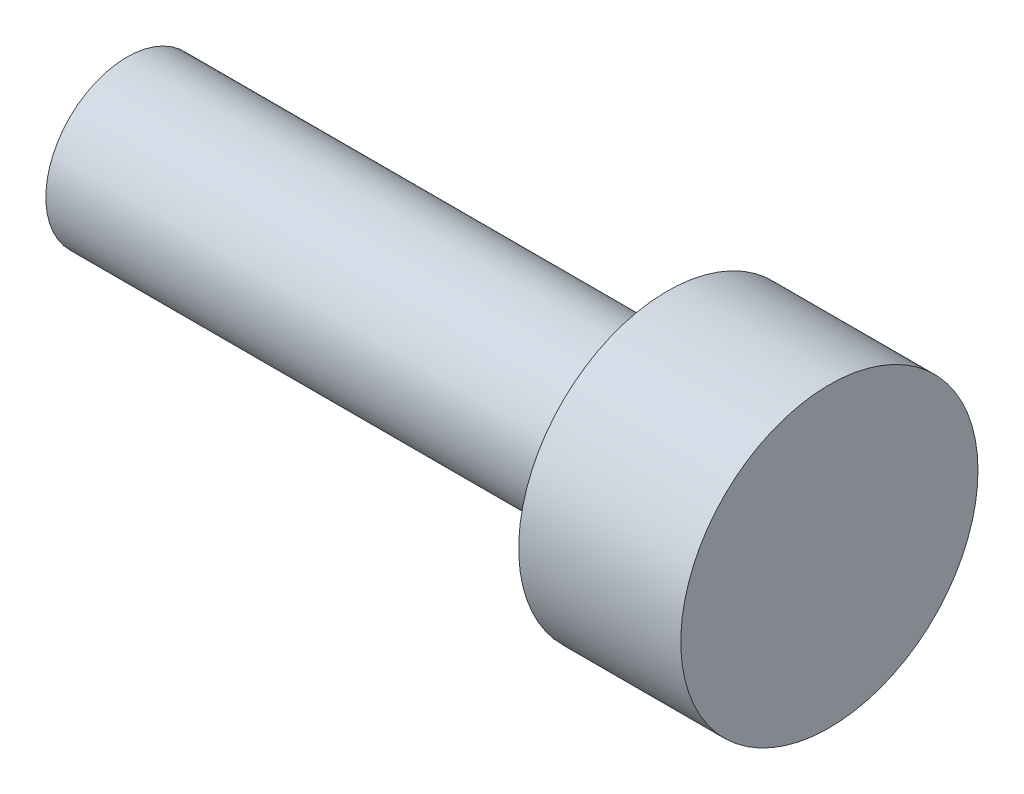
ISO-10303-21;
HEADER;
FILE_DESCRIPTION(('STEP AP214'),'2;1');
FILE_NAME('part.step','',(''),(''),'','','');
FILE_SCHEMA(('AUTOMOTIVE_DESIGN { 1 0 10303 214 1 1 1 1 }'));
ENDSEC;
DATA;
#1=APPLICATION_CONTEXT('core data for automotive mechanical design processes');
#2=APPLICATION_PROTOCOL_DEFINITION('international standard','automotive_design',2000,#1);
#3=PRODUCT_CONTEXT('',#1,'mechanical');
#4=PRODUCT('Part','Part','',(#3));
#5=PRODUCT_RELATED_PRODUCT_CATEGORY('part','',(#4));
#6=PRODUCT_DEFINITION_FORMATION('','',#4);
#7=PRODUCT_DEFINITION_CONTEXT('part definition',#1,'design');
#8=PRODUCT_DEFINITION('design','',#6,#7);
#9=PRODUCT_DEFINITION_SHAPE('','',#8);
#10=(LENGTH_UNIT() NAMED_UNIT(*) SI_UNIT(.MILLI.,.METRE.));
#11=(NAMED_UNIT(*) PLANE_ANGLE_UNIT() SI_UNIT($,.RADIAN.));
#12=(NAMED_UNIT(*) SI_UNIT($,.STERADIAN.) SOLID_ANGLE_UNIT());
#13=UNCERTAINTY_MEASURE_WITH_UNIT(LENGTH_MEASURE(1.E-05),#10,'distance_accuracy_value','');
#14=(GEOMETRIC_REPRESENTATION_CONTEXT(3) GLOBAL_UNCERTAINTY_ASSIGNED_CONTEXT((#13)) GLOBAL_UNIT_ASSIGNED_CONTEXT((#10,
#11,#12)) REPRESENTATION_CONTEXT('',''));
#15=CARTESIAN_POINT('',(0.,0.,0.));
#16=DIRECTION('',(0.,0.,1.));
#17=DIRECTION('',(1.,0.,0.));
#18=AXIS2_PLACEMENT_3D('',#15,#16,#17);
#19=CARTESIAN_POINT('',(3.,0.,0.));
#20=DIRECTION('',(-1.,0.,0.));
#21=DIRECTION('',(0.,0.,1.));
#22=AXIS2_PLACEMENT_3D('',#19,#20,#21);
#23=CYLINDRICAL_SURFACE('',#22,1.5);
#24=CARTESIAN_POINT('',(3.,0.,0.));
#25=DIRECTION('',(1.,0.,0.));
#26=DIRECTION('',(0.,0.,-1.));
#27=AXIS2_PLACEMENT_3D('',#24,#25,#26);
#28=CIRCLE('',#27,1.5);
#29=CARTESIAN_POINT('',(3.,0.,-1.5));
#30=VERTEX_POINT('',#29);
#31=EDGE_CURVE('E11',#30,#30,#28,.T.);
#32=ORIENTED_EDGE('',*,*,#31,.F.);
#33=EDGE_LOOP('',(#32));
#34=FACE_BOUND('',#33,.T.);
#35=CARTESIAN_POINT('',(-7.,0.,0.));
#36=DIRECTION('',(1.,0.,0.));
#37=DIRECTION('',(0.,0.,-1.));
#38=AXIS2_PLACEMENT_3D('',#35,#36,#37);
#39=CIRCLE('',#38,1.5);
#40=CARTESIAN_POINT('',(-7.,0.,-1.5));
#41=VERTEX_POINT('',#40);
#42=EDGE_CURVE('E48',#41,#41,#39,.T.);
#43=ORIENTED_EDGE('',*,*,#42,.T.);
#44=EDGE_LOOP('',(#43));
#45=FACE_BOUND('',#44,.T.);
#46=ADVANCED_FACE('F45',(#34,#45),#23,.T.);
#47=CARTESIAN_POINT('',(3.,0.,0.));
#48=DIRECTION('',(1.,0.,0.));
#49=DIRECTION('',(0.,0.,-1.));
#50=AXIS2_PLACEMENT_3D('',#47,#48,#49);
#51=PLANE('',#50);
#52=ORIENTED_EDGE('',*,*,#31,.T.);
#53=EDGE_LOOP('',(#52));
#54=FACE_BOUND('',#53,.T.);
#55=ADVANCED_FACE('F60',(#54),#51,.T.);
#56=CARTESIAN_POINT('',(-7.,0.,0.));
#57=DIRECTION('',(1.,0.,0.));
#58=DIRECTION('',(0.,0.,-1.));
#59=AXIS2_PLACEMENT_3D('',#56,#57,#58);
#60=PLANE('',#59);
#61=ORIENTED_EDGE('',*,*,#42,.F.);
#62=EDGE_LOOP('',(#61));
#63=FACE_BOUND('',#62,.T.);
#64=ADVANCED_FACE('F58',(#63),#60,.F.);
#65=CLOSED_SHELL('',(#46,#55,#64));
#66=MANIFOLD_SOLID_BREP('B2',#65);
#67=CARTESIAN_POINT('',(6.,0.,0.));
#68=DIRECTION('',(-1.,0.,0.));
#69=DIRECTION('',(0.,0.,1.));
#70=AXIS2_PLACEMENT_3D('',#67,#68,#69);
#71=CYLINDRICAL_SURFACE('',#70,2.75);
#72=CARTESIAN_POINT('',(6.,0.,0.));
#73=DIRECTION('',(1.,0.,0.));
#74=DIRECTION('',(0.,0.,-1.));
#75=AXIS2_PLACEMENT_3D('',#72,#73,#74);
#76=CIRCLE('',#75,2.75);
#77=CARTESIAN_POINT('',(6.,0.,-2.75));
#78=VERTEX_POINT('',#77);
#79=EDGE_CURVE('E44',#78,#78,#76,.T.);
#80=ORIENTED_EDGE('',*,*,#79,.F.);
#81=EDGE_LOOP('',(#80));
#82=FACE_BOUND('',#81,.T.);
#83=CARTESIAN_POINT('',(3.,0.,0.));
#84=DIRECTION('',(1.,0.,0.));
#85=DIRECTION('',(0.,0.,-1.));
#86=AXIS2_PLACEMENT_3D('',#83,#84,#85);
#87=CIRCLE('',#86,2.75);
#88=CARTESIAN_POINT('',(3.,0.,-2.75));
#89=VERTEX_POINT('',#88);
#90=EDGE_CURVE('E89',#89,#89,#87,.T.);
#91=ORIENTED_EDGE('',*,*,#90,.T.);
#92=EDGE_LOOP('',(#91));
#93=FACE_BOUND('',#92,.T.);
#94=ADVANCED_FACE('F86',(#82,#93),#71,.T.);
#95=CARTESIAN_POINT('',(6.,0.,0.));
#96=DIRECTION('',(1.,0.,0.));
#97=DIRECTION('',(0.,0.,-1.));
#98=AXIS2_PLACEMENT_3D('',#95,#96,#97);
#99=PLANE('',#98);
#100=ORIENTED_EDGE('',*,*,#79,.T.);
#101=EDGE_LOOP('',(#100));
#102=FACE_BOUND('',#101,.T.);
#103=ADVANCED_FACE('F101',(#102),#99,.T.);
#104=CARTESIAN_POINT('',(3.,0.,0.));
#105=DIRECTION('',(1.,0.,0.));
#106=DIRECTION('',(0.,0.,-1.));
#107=AXIS2_PLACEMENT_3D('',#104,#105,#106);
#108=PLANE('',#107);
#109=ORIENTED_EDGE('',*,*,#90,.F.);
#110=EDGE_LOOP('',(#109));
#111=FACE_BOUND('',#110,.T.);
#112=ADVANCED_FACE('F99',(#111),#108,.F.);
#113=CLOSED_SHELL('',(#94,#103,#112));
#114=MANIFOLD_SOLID_BREP('B6',#113);
#115=ADVANCED_BREP_SHAPE_REPRESENTATION('',(#18,#66,#114),#14);
#116=SHAPE_DEFINITION_REPRESENTATION(#9,#115);
ENDSEC;
END-ISO-10303-21;
